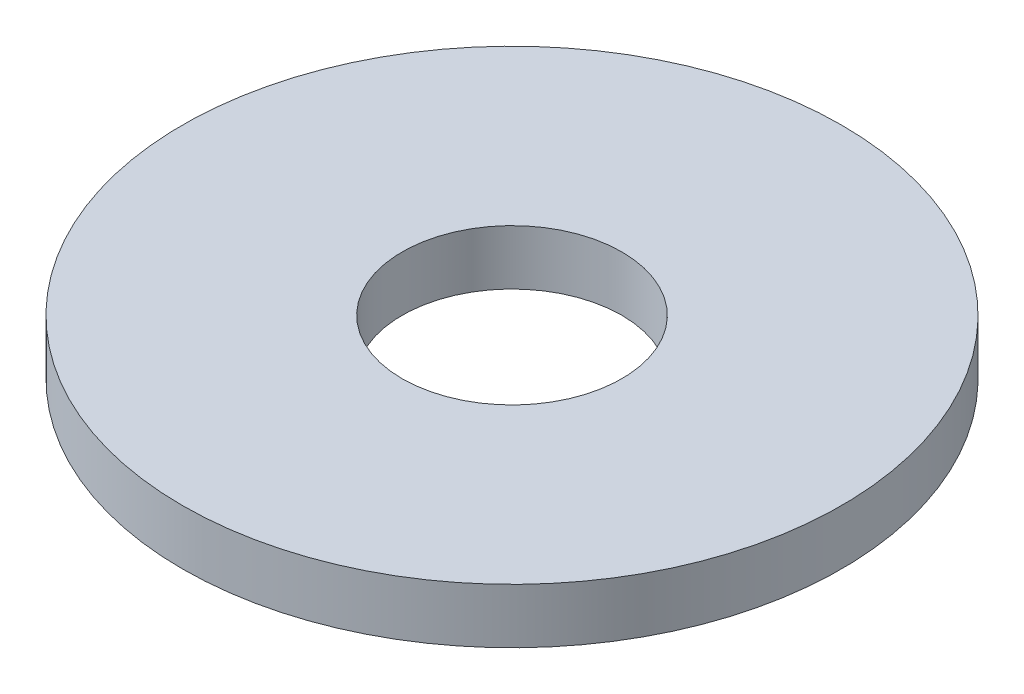
ISO-10303-21;
HEADER;
FILE_DESCRIPTION(('STEP AP214'),'2;1');
FILE_NAME('part.step','',(''),(''),'','','');
FILE_SCHEMA(('AUTOMOTIVE_DESIGN { 1 0 10303 214 1 1 1 1 }'));
ENDSEC;
DATA;
#1=APPLICATION_CONTEXT('core data for automotive mechanical design processes');
#2=APPLICATION_PROTOCOL_DEFINITION('international standard','automotive_design',2000,#1);
#3=PRODUCT_CONTEXT('',#1,'mechanical');
#4=PRODUCT('Part','Part','',(#3));
#5=PRODUCT_RELATED_PRODUCT_CATEGORY('part','',(#4));
#6=PRODUCT_DEFINITION_FORMATION('','',#4);
#7=PRODUCT_DEFINITION_CONTEXT('part definition',#1,'design');
#8=PRODUCT_DEFINITION('design','',#6,#7);
#9=PRODUCT_DEFINITION_SHAPE('','',#8);
#10=(LENGTH_UNIT() NAMED_UNIT(*) SI_UNIT(.MILLI.,.METRE.));
#11=(NAMED_UNIT(*) PLANE_ANGLE_UNIT() SI_UNIT($,.RADIAN.));
#12=(NAMED_UNIT(*) SI_UNIT($,.STERADIAN.) SOLID_ANGLE_UNIT());
#13=UNCERTAINTY_MEASURE_WITH_UNIT(LENGTH_MEASURE(1.E-05),#10,'distance_accuracy_value','');
#14=(GEOMETRIC_REPRESENTATION_CONTEXT(3) GLOBAL_UNCERTAINTY_ASSIGNED_CONTEXT((#13)) GLOBAL_UNIT_ASSIGNED_CONTEXT((#10,
#11,#12)) REPRESENTATION_CONTEXT('',''));
#15=CARTESIAN_POINT('',(0.,0.,0.));
#16=DIRECTION('',(0.,0.,1.));
#17=DIRECTION('',(1.,0.,0.));
#18=AXIS2_PLACEMENT_3D('',#15,#16,#17);
#19=CARTESIAN_POINT('',(0.,1.,0.));
#20=DIRECTION('',(0.,1.,0.));
#21=DIRECTION('',(0.,0.,1.));
#22=AXIS2_PLACEMENT_3D('',#19,#20,#21);
#23=PLANE('',#22);
#24=CARTESIAN_POINT('',(0.,1.,0.));
#25=DIRECTION('',(0.,1.,0.));
#26=DIRECTION('',(0.,0.,1.));
#27=AXIS2_PLACEMENT_3D('',#24,#25,#26);
#28=CIRCLE('',#27,6.);
#29=CARTESIAN_POINT('',(0.,1.,6.));
#30=VERTEX_POINT('',#29);
#31=EDGE_CURVE('E10',#30,#30,#28,.T.);
#32=ORIENTED_EDGE('',*,*,#31,.T.);
#33=EDGE_LOOP('',(#32));
#34=FACE_BOUND('',#33,.T.);
#35=CARTESIAN_POINT('',(0.,1.,0.));
#36=DIRECTION('',(0.,1.,0.));
#37=DIRECTION('',(0.,0.,1.));
#38=AXIS2_PLACEMENT_3D('',#35,#36,#37);
#39=CIRCLE('',#38,2.);
#40=CARTESIAN_POINT('',(0.,1.,2.));
#41=VERTEX_POINT('',#40);
#42=EDGE_CURVE('E46',#41,#41,#39,.T.);
#43=ORIENTED_EDGE('',*,*,#42,.F.);
#44=EDGE_LOOP('',(#43));
#45=FACE_BOUND('',#44,.T.);
#46=ADVANCED_FACE('F35',(#34,#45),#23,.T.);
#47=CARTESIAN_POINT('',(0.,0.,0.));
#48=DIRECTION('',(0.,1.,0.));
#49=DIRECTION('',(0.,0.,1.));
#50=AXIS2_PLACEMENT_3D('',#47,#48,#49);
#51=PLANE('',#50);
#52=CARTESIAN_POINT('',(0.,0.,0.));
#53=DIRECTION('',(0.,1.,0.));
#54=DIRECTION('',(0.,0.,1.));
#55=AXIS2_PLACEMENT_3D('',#52,#53,#54);
#56=CIRCLE('',#55,6.);
#57=CARTESIAN_POINT('',(0.,0.,6.));
#58=VERTEX_POINT('',#57);
#59=EDGE_CURVE('E39',#58,#58,#56,.T.);
#60=ORIENTED_EDGE('',*,*,#59,.F.);
#61=EDGE_LOOP('',(#60));
#62=FACE_BOUND('',#61,.T.);
#63=CARTESIAN_POINT('',(0.,0.,0.));
#64=DIRECTION('',(0.,1.,0.));
#65=DIRECTION('',(0.,0.,1.));
#66=AXIS2_PLACEMENT_3D('',#63,#64,#65);
#67=CIRCLE('',#66,2.);
#68=CARTESIAN_POINT('',(0.,0.,2.));
#69=VERTEX_POINT('',#68);
#70=EDGE_CURVE('E48',#69,#69,#67,.T.);
#71=ORIENTED_EDGE('',*,*,#70,.T.);
#72=EDGE_LOOP('',(#71));
#73=FACE_BOUND('',#72,.T.);
#74=ADVANCED_FACE('F58',(#62,#73),#51,.F.);
#75=CARTESIAN_POINT('',(0.,1.,0.));
#76=DIRECTION('',(0.,-1.,0.));
#77=DIRECTION('',(0.,0.,-1.));
#78=AXIS2_PLACEMENT_3D('',#75,#76,#77);
#79=CYLINDRICAL_SURFACE('',#78,6.);
#80=ORIENTED_EDGE('',*,*,#31,.F.);
#81=EDGE_LOOP('',(#80));
#82=FACE_BOUND('',#81,.T.);
#83=ORIENTED_EDGE('',*,*,#59,.T.);
#84=EDGE_LOOP('',(#83));
#85=FACE_BOUND('',#84,.T.);
#86=ADVANCED_FACE('F37',(#82,#85),#79,.T.);
#87=CARTESIAN_POINT('',(0.,1.,0.));
#88=DIRECTION('',(0.,-1.,0.));
#89=DIRECTION('',(0.,0.,-1.));
#90=AXIS2_PLACEMENT_3D('',#87,#88,#89);
#91=CYLINDRICAL_SURFACE('',#90,2.);
#92=ORIENTED_EDGE('',*,*,#42,.T.);
#93=EDGE_LOOP('',(#92));
#94=FACE_BOUND('',#93,.T.);
#95=ORIENTED_EDGE('',*,*,#70,.F.);
#96=EDGE_LOOP('',(#95));
#97=FACE_BOUND('',#96,.T.);
#98=ADVANCED_FACE('F54',(#94,#97),#91,.F.);
#99=CLOSED_SHELL('',(#46,#74,#86,#98));
#100=MANIFOLD_SOLID_BREP('B2',#99);
#101=ADVANCED_BREP_SHAPE_REPRESENTATION('',(#18,#100),#14);
#102=SHAPE_DEFINITION_REPRESENTATION(#9,#101);
ENDSEC;
END-ISO-10303-21;
